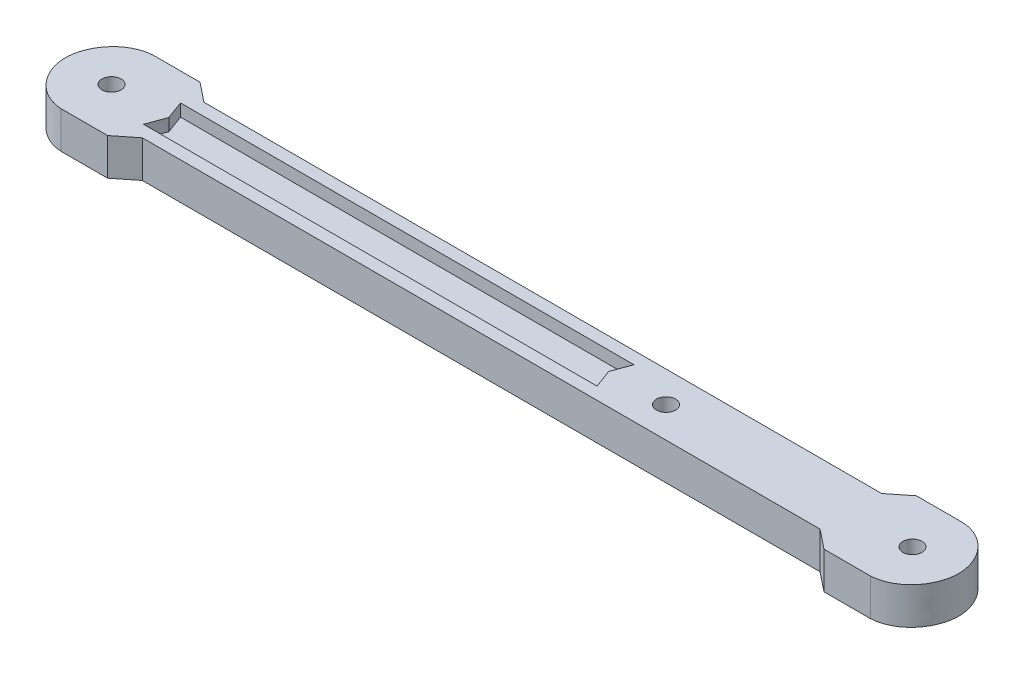
ISO-10303-21;
HEADER;
FILE_DESCRIPTION(('STEP AP214'),'2;1');
FILE_NAME('part.step','',(''),(''),'','','');
FILE_SCHEMA(('AUTOMOTIVE_DESIGN { 1 0 10303 214 1 1 1 1 }'));
ENDSEC;
DATA;
#1=APPLICATION_CONTEXT('core data for automotive mechanical design processes');
#2=APPLICATION_PROTOCOL_DEFINITION('international standard','automotive_design',2000,#1);
#3=PRODUCT_CONTEXT('',#1,'mechanical');
#4=PRODUCT('Part','Part','',(#3));
#5=PRODUCT_RELATED_PRODUCT_CATEGORY('part','',(#4));
#6=PRODUCT_DEFINITION_FORMATION('','',#4);
#7=PRODUCT_DEFINITION_CONTEXT('part definition',#1,'design');
#8=PRODUCT_DEFINITION('design','',#6,#7);
#9=PRODUCT_DEFINITION_SHAPE('','',#8);
#10=(LENGTH_UNIT() NAMED_UNIT(*) SI_UNIT(.MILLI.,.METRE.));
#11=(NAMED_UNIT(*) PLANE_ANGLE_UNIT() SI_UNIT($,.RADIAN.));
#12=(NAMED_UNIT(*) SI_UNIT($,.STERADIAN.) SOLID_ANGLE_UNIT());
#13=UNCERTAINTY_MEASURE_WITH_UNIT(LENGTH_MEASURE(1.E-05),#10,'distance_accuracy_value','');
#14=(GEOMETRIC_REPRESENTATION_CONTEXT(3) GLOBAL_UNCERTAINTY_ASSIGNED_CONTEXT((#13)) GLOBAL_UNIT_ASSIGNED_CONTEXT((#10,
#11,#12)) REPRESENTATION_CONTEXT('',''));
#15=CARTESIAN_POINT('',(0.,0.,0.));
#16=DIRECTION('',(0.,0.,1.));
#17=DIRECTION('',(1.,0.,0.));
#18=AXIS2_PLACEMENT_3D('',#15,#16,#17);
#19=CARTESIAN_POINT('',(0.,6.,0.));
#20=DIRECTION('',(0.,-1.,0.));
#21=DIRECTION('',(0.,0.,-1.));
#22=AXIS2_PLACEMENT_3D('',#19,#20,#21);
#23=PLANE('',#22);
#24=DIRECTION('',(0.344254649158423,0.,0.938876315886609));
#25=VECTOR('',#24,1.);
#26=CARTESIAN_POINT('',(-81.8,6.,-3.00000000000001));
#27=LINE('',#26,#25);
#28=CARTESIAN_POINT('',(-81.8,6.,-3.00000000000001));
#29=VERTEX_POINT('',#28);
#30=CARTESIAN_POINT('',(-80.7,6.,0.));
#31=VERTEX_POINT('',#30);
#32=EDGE_CURVE('E192',#29,#31,#27,.T.);
#33=ORIENTED_EDGE('',*,*,#32,.F.);
#34=DIRECTION('',(-1.,0.,0.));
#35=VECTOR('',#34,1.);
#36=CARTESIAN_POINT('',(-81.8,6.,-3.00000000000001));
#37=LINE('',#36,#35);
#38=CARTESIAN_POINT('',(-8.2,6.,-3.00000000000001));
#39=VERTEX_POINT('',#38);
#40=EDGE_CURVE('E47',#39,#29,#37,.T.);
#41=ORIENTED_EDGE('',*,*,#40,.F.);
#42=DIRECTION('',(0.344254649158422,0.,-0.938876315886609));
#43=VECTOR('',#42,1.);
#44=CARTESIAN_POINT('',(-9.3,6.,0.));
#45=LINE('',#44,#43);
#46=CARTESIAN_POINT('',(-9.3,6.,0.));
#47=VERTEX_POINT('',#46);
#48=EDGE_CURVE('E178',#47,#39,#45,.T.);
#49=ORIENTED_EDGE('',*,*,#48,.F.);
#50=DIRECTION('',(-0.344254649158423,0.,-0.938876315886609));
#51=VECTOR('',#50,1.);
#52=CARTESIAN_POINT('',(-9.3,6.,0.));
#53=LINE('',#52,#51);
#54=CARTESIAN_POINT('',(-8.2,6.,3.00000000000001));
#55=VERTEX_POINT('',#54);
#56=EDGE_CURVE('E181',#55,#47,#53,.T.);
#57=ORIENTED_EDGE('',*,*,#56,.F.);
#58=DIRECTION('',(1.,0.,0.));
#59=VECTOR('',#58,1.);
#60=CARTESIAN_POINT('',(-81.8,6.,3.00000000000001));
#61=LINE('',#60,#59);
#62=CARTESIAN_POINT('',(-81.8,6.,3.00000000000001));
#63=VERTEX_POINT('',#62);
#64=EDGE_CURVE('E197',#63,#55,#61,.T.);
#65=ORIENTED_EDGE('',*,*,#64,.F.);
#66=DIRECTION('',(-0.344254649158423,0.,0.938876315886609));
#67=VECTOR('',#66,1.);
#68=CARTESIAN_POINT('',(-81.8,6.,3.00000000000001));
#69=LINE('',#68,#67);
#70=EDGE_CURVE('E194',#31,#63,#69,.T.);
#71=ORIENTED_EDGE('',*,*,#70,.F.);
#72=EDGE_LOOP('',(#33,#41,#49,#57,#65,#71));
#73=FACE_BOUND('',#72,.T.);
#74=CARTESIAN_POINT('',(-90.,6.,0.));
#75=DIRECTION('',(0.,1.,0.));
#76=DIRECTION('',(0.,0.,1.));
#77=AXIS2_PLACEMENT_3D('',#74,#75,#76);
#78=CIRCLE('',#77,1.54999999999999);
#79=CARTESIAN_POINT('',(-90.,6.,1.54999999999999));
#80=VERTEX_POINT('',#79);
#81=EDGE_CURVE('E312',#80,#80,#78,.T.);
#82=ORIENTED_EDGE('',*,*,#81,.F.);
#83=EDGE_LOOP('',(#82));
#84=FACE_BOUND('',#83,.T.);
#85=CARTESIAN_POINT('',(0.,6.,0.));
#86=DIRECTION('',(0.,1.,0.));
#87=DIRECTION('',(0.,0.,1.));
#88=AXIS2_PLACEMENT_3D('',#85,#86,#87);
#89=CIRCLE('',#88,1.55);
#90=CARTESIAN_POINT('',(0.,6.,1.55));
#91=VERTEX_POINT('',#90);
#92=EDGE_CURVE('E378',#91,#91,#89,.T.);
#93=ORIENTED_EDGE('',*,*,#92,.F.);
#94=EDGE_LOOP('',(#93));
#95=FACE_BOUND('',#94,.T.);
#96=CARTESIAN_POINT('',(40.,6.,0.));
#97=DIRECTION('',(0.,1.,0.));
#98=DIRECTION('',(0.,0.,1.));
#99=AXIS2_PLACEMENT_3D('',#96,#97,#98);
#100=CIRCLE('',#99,1.54999999999999);
#101=CARTESIAN_POINT('',(40.,6.,1.54999999999999));
#102=VERTEX_POINT('',#101);
#103=EDGE_CURVE('E372',#102,#102,#100,.T.);
#104=ORIENTED_EDGE('',*,*,#103,.F.);
#105=EDGE_LOOP('',(#104));
#106=FACE_BOUND('',#105,.T.);
#107=CARTESIAN_POINT('',(-90.,6.,7.50000000000001));
#108=CARTESIAN_POINT('',(-94.2667133205138,6.,7.71851474808039));
#109=CARTESIAN_POINT('',(-100.733567708112,6.,6.06310139238379E-05));
#110=CARTESIAN_POINT('',(-94.2661512521154,6.,-7.71898848491378));
#111=CARTESIAN_POINT('',(-90.,6.,-7.50000000000001));
#112=B_SPLINE_CURVE_WITH_KNOTS('',3,(#107,#108,#109,#110,#111),.UNSPECIFIED.,.F.,.F.,(4,1,4),
(0.,0.499994291907177,1.),.UNSPECIFIED.);
#113=CARTESIAN_POINT('',(-90.6890486058825,6.,7.5));
#114=VERTEX_POINT('',#113);
#115=CARTESIAN_POINT('',(-90.6903193577175,6.,-7.50000000000001));
#116=VERTEX_POINT('',#115);
#117=EDGE_CURVE('E358',#114,#116,#112,.T.);
#118=ORIENTED_EDGE('',*,*,#117,.F.);
#119=DIRECTION('',(1.,0.,0.));
#120=VECTOR('',#119,1.);
#121=CARTESIAN_POINT('',(-100.,6.,7.50000000000002));
#122=LINE('',#121,#120);
#123=CARTESIAN_POINT('',(-83.1408644447975,6.,7.50000000000002));
#124=VERTEX_POINT('',#123);
#125=EDGE_CURVE('E280',#114,#124,#122,.T.);
#126=ORIENTED_EDGE('',*,*,#125,.T.);
#127=DIRECTION('',(-0.782408646723996,0.,0.622765372778164));
#128=VECTOR('',#127,1.);
#129=CARTESIAN_POINT('',(-28.5906516998124,6.,-35.9197445510119));
#130=LINE('',#129,#128);
#131=CARTESIAN_POINT('',(-80.,6.,4.99999999999999));
#132=VERTEX_POINT('',#131);
#133=EDGE_CURVE('E299',#132,#124,#130,.T.);
#134=ORIENTED_EDGE('',*,*,#133,.F.);
#135=DIRECTION('',(-1.,0.,0.));
#136=VECTOR('',#135,1.);
#137=CARTESIAN_POINT('',(0.,6.,4.99999999999999));
#138=LINE('',#137,#136);
#139=CARTESIAN_POINT('',(30.,6.,5.));
#140=VERTEX_POINT('',#139);
#141=EDGE_CURVE('E298',#140,#132,#138,.T.);
#142=ORIENTED_EDGE('',*,*,#141,.F.);
#143=DIRECTION('',(-0.782408646723998,0.,-0.622765372778161));
#144=VECTOR('',#143,1.);
#145=CARTESIAN_POINT('',(9.19881622323604,6.,-11.5568939239154));
#146=LINE('',#145,#144);
#147=CARTESIAN_POINT('',(33.1408644447975,6.,7.50000000000002));
#148=VERTEX_POINT('',#147);
#149=EDGE_CURVE('E287',#148,#140,#146,.T.);
#150=ORIENTED_EDGE('',*,*,#149,.F.);
#151=CARTESIAN_POINT('',(40.6593471197415,6.,7.49999999999977));
#152=VERTEX_POINT('',#151);
#153=EDGE_CURVE('E295',#148,#152,#122,.T.);
#154=ORIENTED_EDGE('',*,*,#153,.T.);
#155=CARTESIAN_POINT('',(40.,6.,-7.50000000000001));
#156=CARTESIAN_POINT('',(44.2928932188134,6.,-7.70710678118656));
#157=CARTESIAN_POINT('',(50.7071067811866,6.,0.));
#158=CARTESIAN_POINT('',(44.2928932188134,6.,7.70710678118655));
#159=CARTESIAN_POINT('',(40.,6.,7.50000000000001));
#160=B_SPLINE_CURVE_WITH_KNOTS('',3,(#155,#156,#157,#158,#159),.UNSPECIFIED.,.F.,.F.,(4,1,4),
(0.,0.5,1.),.UNSPECIFIED.);
#161=CARTESIAN_POINT('',(40.659347119737,6.,-7.5));
#162=VERTEX_POINT('',#161);
#163=EDGE_CURVE('E350',#162,#152,#160,.T.);
#164=ORIENTED_EDGE('',*,*,#163,.F.);
#165=DIRECTION('',(-1.,0.,0.));
#166=VECTOR('',#165,1.);
#167=CARTESIAN_POINT('',(30.,6.,-7.5));
#168=LINE('',#167,#166);
#169=CARTESIAN_POINT('',(33.1408644447975,6.,-7.5));
#170=VERTEX_POINT('',#169);
#171=EDGE_CURVE('E268',#162,#170,#168,.T.);
#172=ORIENTED_EDGE('',*,*,#171,.T.);
#173=DIRECTION('',(0.782408646724001,0.,-0.622765372778157));
#174=VECTOR('',#173,1.);
#175=CARTESIAN_POINT('',(9.19881622323589,6.,11.5568939239154));
#176=LINE('',#175,#174);
#177=CARTESIAN_POINT('',(30.,6.,-5.));
#178=VERTEX_POINT('',#177);
#179=EDGE_CURVE('E348',#178,#170,#176,.T.);
#180=ORIENTED_EDGE('',*,*,#179,.F.);
#181=DIRECTION('',(1.,0.,0.));
#182=VECTOR('',#181,1.);
#183=CARTESIAN_POINT('',(0.,6.,-5.00000000000001));
#184=LINE('',#183,#182);
#185=CARTESIAN_POINT('',(-80.,6.,-5.00000000000001));
#186=VERTEX_POINT('',#185);
#187=EDGE_CURVE('E368',#186,#178,#184,.T.);
#188=ORIENTED_EDGE('',*,*,#187,.F.);
#189=DIRECTION('',(0.782408646724001,0.,0.622765372778158));
#190=VECTOR('',#189,1.);
#191=CARTESIAN_POINT('',(-28.5906516998118,6.,35.9197445510117));
#192=LINE('',#191,#190);
#193=CARTESIAN_POINT('',(-83.1408644447975,6.,-7.5));
#194=VERTEX_POINT('',#193);
#195=EDGE_CURVE('E343',#194,#186,#192,.T.);
#196=ORIENTED_EDGE('',*,*,#195,.F.);
#197=EDGE_CURVE('E306',#194,#116,#168,.T.);
#198=ORIENTED_EDGE('',*,*,#197,.T.);
#199=EDGE_LOOP('',(#118,#126,#134,#142,#150,#154,#164,#172,#180,#188,#196,#198));
#200=FACE_BOUND('',#199,.T.);
#201=ADVANCED_FACE('F32',(#73,#84,#95,#106,#200),#23,.F.);
#202=CARTESIAN_POINT('',(0.,0.,0.));
#203=DIRECTION('',(0.,-1.,0.));
#204=DIRECTION('',(0.,0.,-1.));
#205=AXIS2_PLACEMENT_3D('',#202,#203,#204);
#206=PLANE('',#205);
#207=CARTESIAN_POINT('',(0.,0.,0.));
#208=DIRECTION('',(0.,1.,0.));
#209=DIRECTION('',(0.,0.,1.));
#210=AXIS2_PLACEMENT_3D('',#207,#208,#209);
#211=CIRCLE('',#210,1.55);
#212=CARTESIAN_POINT('',(0.,0.,1.55));
#213=VERTEX_POINT('',#212);
#214=EDGE_CURVE('E375',#213,#213,#211,.T.);
#215=ORIENTED_EDGE('',*,*,#214,.T.);
#216=EDGE_LOOP('',(#215));
#217=FACE_BOUND('',#216,.T.);
#218=CARTESIAN_POINT('',(-90.,0.,0.));
#219=DIRECTION('',(0.,1.,0.));
#220=DIRECTION('',(0.,0.,1.));
#221=AXIS2_PLACEMENT_3D('',#218,#219,#220);
#222=CIRCLE('',#221,1.54999999999999);
#223=CARTESIAN_POINT('',(-90.,0.,1.54999999999999));
#224=VERTEX_POINT('',#223);
#225=EDGE_CURVE('E381',#224,#224,#222,.T.);
#226=ORIENTED_EDGE('',*,*,#225,.T.);
#227=EDGE_LOOP('',(#226));
#228=FACE_BOUND('',#227,.T.);
#229=CARTESIAN_POINT('',(40.,0.,0.));
#230=DIRECTION('',(0.,1.,0.));
#231=DIRECTION('',(0.,0.,1.));
#232=AXIS2_PLACEMENT_3D('',#229,#230,#231);
#233=CIRCLE('',#232,1.54999999999999);
#234=CARTESIAN_POINT('',(40.,0.,1.54999999999999));
#235=VERTEX_POINT('',#234);
#236=EDGE_CURVE('E371',#235,#235,#233,.T.);
#237=ORIENTED_EDGE('',*,*,#236,.T.);
#238=EDGE_LOOP('',(#237));
#239=FACE_BOUND('',#238,.T.);
#240=DIRECTION('',(1.,0.,0.));
#241=VECTOR('',#240,1.);
#242=CARTESIAN_POINT('',(50.,0.,7.5));
#243=LINE('',#242,#241);
#244=CARTESIAN_POINT('',(-90.6890486058821,0.,7.50000000000002));
#245=VERTEX_POINT('',#244);
#246=CARTESIAN_POINT('',(-83.1408644447975,0.,7.50000000000002));
#247=VERTEX_POINT('',#246);
#248=EDGE_CURVE('E311',#245,#247,#243,.T.);
#249=ORIENTED_EDGE('',*,*,#248,.F.);
#250=CARTESIAN_POINT('',(-90.,0.,7.50000000000001));
#251=CARTESIAN_POINT('',(-94.2667133205138,0.,7.71851474808039));
#252=CARTESIAN_POINT('',(-100.733567708112,0.,6.06310139238379E-05));
#253=CARTESIAN_POINT('',(-94.2661512521154,0.,-7.71898848491378));
#254=CARTESIAN_POINT('',(-90.,0.,-7.50000000000001));
#255=B_SPLINE_CURVE_WITH_KNOTS('',3,(#250,#251,#252,#253,#254),.UNSPECIFIED.,.F.,.F.,(4,1,4),
(0.,0.499994291907177,1.),.UNSPECIFIED.);
#256=CARTESIAN_POINT('',(-90.6903193577175,0.,-7.5));
#257=VERTEX_POINT('',#256);
#258=EDGE_CURVE('E204',#245,#257,#255,.T.);
#259=ORIENTED_EDGE('',*,*,#258,.T.);
#260=DIRECTION('',(-1.,0.,0.));
#261=VECTOR('',#260,1.);
#262=CARTESIAN_POINT('',(40.,0.,-7.5));
#263=LINE('',#262,#261);
#264=CARTESIAN_POINT('',(-83.1408644447975,0.,-7.5));
#265=VERTEX_POINT('',#264);
#266=EDGE_CURVE('E313',#265,#257,#263,.T.);
#267=ORIENTED_EDGE('',*,*,#266,.F.);
#268=DIRECTION('',(0.782408646724001,0.,0.622765372778157));
#269=VECTOR('',#268,1.);
#270=CARTESIAN_POINT('',(-83.1408644447975,0.,-7.5));
#271=LINE('',#270,#269);
#272=CARTESIAN_POINT('',(-80.,0.,-5.00000000000001));
#273=VERTEX_POINT('',#272);
#274=EDGE_CURVE('E406',#265,#273,#271,.T.);
#275=ORIENTED_EDGE('',*,*,#274,.T.);
#276=DIRECTION('',(1.,0.,0.));
#277=VECTOR('',#276,1.);
#278=CARTESIAN_POINT('',(30.,0.,-5.));
#279=LINE('',#278,#277);
#280=CARTESIAN_POINT('',(30.,0.,-5.));
#281=VERTEX_POINT('',#280);
#282=EDGE_CURVE('E407',#273,#281,#279,.T.);
#283=ORIENTED_EDGE('',*,*,#282,.T.);
#284=DIRECTION('',(0.782408646724001,0.,-0.622765372778157));
#285=VECTOR('',#284,1.);
#286=CARTESIAN_POINT('',(33.1408644447975,0.,-7.5));
#287=LINE('',#286,#285);
#288=CARTESIAN_POINT('',(33.1408644447975,0.,-7.5));
#289=VERTEX_POINT('',#288);
#290=EDGE_CURVE('E416',#281,#289,#287,.T.);
#291=ORIENTED_EDGE('',*,*,#290,.T.);
#292=CARTESIAN_POINT('',(40.659347119737,0.,-7.5));
#293=VERTEX_POINT('',#292);
#294=EDGE_CURVE('E270',#293,#289,#263,.T.);
#295=ORIENTED_EDGE('',*,*,#294,.F.);
#296=CARTESIAN_POINT('',(40.,0.,-7.50000000000001));
#297=CARTESIAN_POINT('',(44.2928932188134,0.,-7.70710678118656));
#298=CARTESIAN_POINT('',(50.7071067811866,0.,0.));
#299=CARTESIAN_POINT('',(44.2928932188134,0.,7.70710678118655));
#300=CARTESIAN_POINT('',(40.,0.,7.50000000000001));
#301=B_SPLINE_CURVE_WITH_KNOTS('',3,(#296,#297,#298,#299,#300),.UNSPECIFIED.,.F.,.F.,(4,1,4),
(0.,0.5,1.),.UNSPECIFIED.);
#302=CARTESIAN_POINT('',(40.6593471197369,0.,7.5));
#303=VERTEX_POINT('',#302);
#304=EDGE_CURVE('E418',#293,#303,#301,.T.);
#305=ORIENTED_EDGE('',*,*,#304,.T.);
#306=CARTESIAN_POINT('',(33.1408644447975,0.,7.5));
#307=VERTEX_POINT('',#306);
#308=EDGE_CURVE('E310',#307,#303,#243,.T.);
#309=ORIENTED_EDGE('',*,*,#308,.F.);
#310=DIRECTION('',(-0.782408646723998,0.,-0.622765372778161));
#311=VECTOR('',#310,1.);
#312=CARTESIAN_POINT('',(33.1408644447975,0.,7.50000000000002));
#313=LINE('',#312,#311);
#314=CARTESIAN_POINT('',(30.,0.,5.));
#315=VERTEX_POINT('',#314);
#316=EDGE_CURVE('E55',#307,#315,#313,.T.);
#317=ORIENTED_EDGE('',*,*,#316,.T.);
#318=DIRECTION('',(-1.,0.,0.));
#319=VECTOR('',#318,1.);
#320=CARTESIAN_POINT('',(-80.,0.,4.99999999999999));
#321=LINE('',#320,#319);
#322=CARTESIAN_POINT('',(-80.,0.,4.99999999999999));
#323=VERTEX_POINT('',#322);
#324=EDGE_CURVE('E333',#315,#323,#321,.T.);
#325=ORIENTED_EDGE('',*,*,#324,.T.);
#326=DIRECTION('',(-0.782408646723996,0.,0.622765372778164));
#327=VECTOR('',#326,1.);
#328=CARTESIAN_POINT('',(-83.1408644447975,0.,7.50000000000002));
#329=LINE('',#328,#327);
#330=EDGE_CURVE('E330',#323,#247,#329,.T.);
#331=ORIENTED_EDGE('',*,*,#330,.T.);
#332=EDGE_LOOP('',(#249,#259,#267,#275,#283,#291,#295,#305,#309,#317,#325,#331));
#333=FACE_BOUND('',#332,.T.);
#334=ADVANCED_FACE('F249',(#217,#228,#239,#333),#206,.T.);
#335=CARTESIAN_POINT('',(50.,6.,7.5));
#336=DIRECTION('',(0.,0.,-1.));
#337=DIRECTION('',(-1.,0.,0.));
#338=AXIS2_PLACEMENT_3D('',#335,#336,#337);
#339=PLANE('',#338);
#340=DIRECTION('',(0.,-1.,0.));
#341=VECTOR('',#340,1.);
#342=CARTESIAN_POINT('',(-83.1408644447975,6.,7.5));
#343=LINE('',#342,#341);
#344=EDGE_CURVE('E11',#124,#247,#343,.T.);
#345=ORIENTED_EDGE('',*,*,#344,.F.);
#346=ORIENTED_EDGE('',*,*,#125,.F.);
#347=DIRECTION('',(0.,-1.,0.));
#348=VECTOR('',#347,1.);
#349=CARTESIAN_POINT('',(-90.6890486058821,10.,7.50000000000002));
#350=LINE('',#349,#348);
#351=EDGE_CURVE('E300',#245,#114,#350,.F.);
#352=ORIENTED_EDGE('',*,*,#351,.F.);
#353=ORIENTED_EDGE('',*,*,#248,.T.);
#354=EDGE_LOOP('',(#345,#346,#352,#353));
#355=FACE_BOUND('',#354,.T.);
#356=ADVANCED_FACE('F34',(#355),#339,.F.);
#357=DIRECTION('',(0.,-1.,0.));
#358=VECTOR('',#357,1.);
#359=CARTESIAN_POINT('',(40.6593471197369,10.,7.5));
#360=LINE('',#359,#358);
#361=EDGE_CURVE('E304',#152,#303,#360,.T.);
#362=ORIENTED_EDGE('',*,*,#361,.F.);
#363=ORIENTED_EDGE('',*,*,#153,.F.);
#364=DIRECTION('',(0.,1.,0.));
#365=VECTOR('',#364,1.);
#366=CARTESIAN_POINT('',(33.1408644447975,6.,7.5));
#367=LINE('',#366,#365);
#368=EDGE_CURVE('E40',#307,#148,#367,.T.);
#369=ORIENTED_EDGE('',*,*,#368,.F.);
#370=ORIENTED_EDGE('',*,*,#308,.T.);
#371=EDGE_LOOP('',(#362,#363,#369,#370));
#372=FACE_BOUND('',#371,.T.);
#373=ADVANCED_FACE('F255',(#372),#339,.F.);
#374=CARTESIAN_POINT('',(40.,6.,-7.5));
#375=DIRECTION('',(0.,0.,1.));
#376=DIRECTION('',(1.,0.,0.));
#377=AXIS2_PLACEMENT_3D('',#374,#375,#376);
#378=PLANE('',#377);
#379=DIRECTION('',(0.,-1.,0.));
#380=VECTOR('',#379,1.);
#381=CARTESIAN_POINT('',(33.1408644447975,6.,-7.5));
#382=LINE('',#381,#380);
#383=EDGE_CURVE('E266',#170,#289,#382,.T.);
#384=ORIENTED_EDGE('',*,*,#383,.F.);
#385=ORIENTED_EDGE('',*,*,#171,.F.);
#386=DIRECTION('',(0.,-1.,0.));
#387=VECTOR('',#386,1.);
#388=CARTESIAN_POINT('',(40.659347119737,10.,-7.5));
#389=LINE('',#388,#387);
#390=EDGE_CURVE('E275',#293,#162,#389,.F.);
#391=ORIENTED_EDGE('',*,*,#390,.F.);
#392=ORIENTED_EDGE('',*,*,#294,.T.);
#393=EDGE_LOOP('',(#384,#385,#391,#392));
#394=FACE_BOUND('',#393,.T.);
#395=ADVANCED_FACE('F253',(#394),#378,.F.);
#396=ORIENTED_EDGE('',*,*,#266,.T.);
#397=DIRECTION('',(0.,-1.,0.));
#398=VECTOR('',#397,1.);
#399=CARTESIAN_POINT('',(-90.6903193577175,10.,-7.5));
#400=LINE('',#399,#398);
#401=EDGE_CURVE('E278',#116,#257,#400,.T.);
#402=ORIENTED_EDGE('',*,*,#401,.F.);
#403=ORIENTED_EDGE('',*,*,#197,.F.);
#404=DIRECTION('',(0.,1.,0.));
#405=VECTOR('',#404,1.);
#406=CARTESIAN_POINT('',(-83.1408644447975,6.,-7.5));
#407=LINE('',#406,#405);
#408=EDGE_CURVE('E276',#265,#194,#407,.T.);
#409=ORIENTED_EDGE('',*,*,#408,.F.);
#410=EDGE_LOOP('',(#396,#402,#403,#409));
#411=FACE_BOUND('',#410,.T.);
#412=ADVANCED_FACE('F245',(#411),#378,.F.);
#413=CARTESIAN_POINT('',(-90.,6.,0.));
#414=DIRECTION('',(0.,-1.,0.));
#415=DIRECTION('',(0.,0.,-1.));
#416=AXIS2_PLACEMENT_3D('',#413,#414,#415);
#417=CYLINDRICAL_SURFACE('',#416,1.54999999999999);
#418=ORIENTED_EDGE('',*,*,#81,.T.);
#419=EDGE_LOOP('',(#418));
#420=FACE_BOUND('',#419,.T.);
#421=ORIENTED_EDGE('',*,*,#225,.F.);
#422=EDGE_LOOP('',(#421));
#423=FACE_BOUND('',#422,.T.);
#424=ADVANCED_FACE('F241',(#420,#423),#417,.F.);
#425=CARTESIAN_POINT('',(0.,6.,0.));
#426=DIRECTION('',(0.,-1.,0.));
#427=DIRECTION('',(0.,0.,-1.));
#428=AXIS2_PLACEMENT_3D('',#425,#426,#427);
#429=CYLINDRICAL_SURFACE('',#428,1.55);
#430=ORIENTED_EDGE('',*,*,#92,.T.);
#431=EDGE_LOOP('',(#430));
#432=FACE_BOUND('',#431,.T.);
#433=ORIENTED_EDGE('',*,*,#214,.F.);
#434=EDGE_LOOP('',(#433));
#435=FACE_BOUND('',#434,.T.);
#436=ADVANCED_FACE('F237',(#432,#435),#429,.F.);
#437=CARTESIAN_POINT('',(40.,6.,0.));
#438=DIRECTION('',(0.,-1.,0.));
#439=DIRECTION('',(0.,0.,-1.));
#440=AXIS2_PLACEMENT_3D('',#437,#438,#439);
#441=CYLINDRICAL_SURFACE('',#440,1.54999999999999);
#442=ORIENTED_EDGE('',*,*,#103,.T.);
#443=EDGE_LOOP('',(#442));
#444=FACE_BOUND('',#443,.T.);
#445=ORIENTED_EDGE('',*,*,#236,.F.);
#446=EDGE_LOOP('',(#445));
#447=FACE_BOUND('',#446,.T.);
#448=ADVANCED_FACE('F233',(#444,#447),#441,.F.);
#449=CARTESIAN_POINT('',(33.1408644447975,10.,-7.5));
#450=DIRECTION('',(-0.622765372778157,0.,-0.782408646724001));
#451=DIRECTION('',(-0.782408646724001,0.,0.622765372778157));
#452=AXIS2_PLACEMENT_3D('',#449,#450,#451);
#453=PLANE('',#452);
#454=ORIENTED_EDGE('',*,*,#179,.T.);
#455=ORIENTED_EDGE('',*,*,#383,.T.);
#456=ORIENTED_EDGE('',*,*,#290,.F.);
#457=DIRECTION('',(0.,-1.,0.));
#458=VECTOR('',#457,1.);
#459=CARTESIAN_POINT('',(30.,10.,-5.));
#460=LINE('',#459,#458);
#461=EDGE_CURVE('E336',#178,#281,#460,.T.);
#462=ORIENTED_EDGE('',*,*,#461,.F.);
#463=EDGE_LOOP('',(#454,#455,#456,#462));
#464=FACE_BOUND('',#463,.T.);
#465=ADVANCED_FACE('F236',(#464),#453,.T.);
#466=CARTESIAN_POINT('',(-83.1408644447975,10.,-7.5));
#467=DIRECTION('',(0.622765372778158,0.,-0.782408646724001));
#468=DIRECTION('',(-0.782408646724001,0.,-0.622765372778158));
#469=AXIS2_PLACEMENT_3D('',#466,#467,#468);
#470=PLANE('',#469);
#471=ORIENTED_EDGE('',*,*,#195,.T.);
#472=DIRECTION('',(0.,-1.,0.));
#473=VECTOR('',#472,1.);
#474=CARTESIAN_POINT('',(-80.,10.,-5.00000000000001));
#475=LINE('',#474,#473);
#476=EDGE_CURVE('E334',#186,#273,#475,.T.);
#477=ORIENTED_EDGE('',*,*,#476,.T.);
#478=ORIENTED_EDGE('',*,*,#274,.F.);
#479=ORIENTED_EDGE('',*,*,#408,.T.);
#480=EDGE_LOOP('',(#471,#477,#478,#479));
#481=FACE_BOUND('',#480,.T.);
#482=ADVANCED_FACE('F231',(#481),#470,.T.);
#483=CARTESIAN_POINT('',(30.,10.,-5.));
#484=DIRECTION('',(0.,0.,-1.));
#485=DIRECTION('',(-1.,0.,0.));
#486=AXIS2_PLACEMENT_3D('',#483,#484,#485);
#487=PLANE('',#486);
#488=ORIENTED_EDGE('',*,*,#187,.T.);
#489=ORIENTED_EDGE('',*,*,#461,.T.);
#490=ORIENTED_EDGE('',*,*,#282,.F.);
#491=ORIENTED_EDGE('',*,*,#476,.F.);
#492=EDGE_LOOP('',(#488,#489,#490,#491));
#493=FACE_BOUND('',#492,.T.);
#494=ADVANCED_FACE('F431',(#493),#487,.T.);
#495=CARTESIAN_POINT('',(40.,10.,-7.50000000000001));
#496=CARTESIAN_POINT('',(44.2928932188134,10.,-7.70710678118656));
#497=CARTESIAN_POINT('',(50.7071067811866,10.,0.));
#498=CARTESIAN_POINT('',(44.2928932188134,10.,7.70710678118655));
#499=CARTESIAN_POINT('',(40.,10.,7.50000000000001));
#500=B_SPLINE_CURVE_WITH_KNOTS('',3,(#495,#496,#497,#498,#499),.UNSPECIFIED.,.F.,.F.,(4,1,4),
(0.,0.5,1.),.UNSPECIFIED.);
#501=DIRECTION('',(0.,-1.,0.));
#502=VECTOR('',#501,1.);
#503=SURFACE_OF_LINEAR_EXTRUSION('',#500,#502);
#504=ORIENTED_EDGE('',*,*,#361,.T.);
#505=ORIENTED_EDGE('',*,*,#304,.F.);
#506=ORIENTED_EDGE('',*,*,#390,.T.);
#507=ORIENTED_EDGE('',*,*,#163,.T.);
#508=EDGE_LOOP('',(#504,#505,#506,#507));
#509=FACE_BOUND('',#508,.T.);
#510=ADVANCED_FACE('F229',(#509),#503,.T.);
#511=CARTESIAN_POINT('',(-90.,10.,7.50000000000001));
#512=CARTESIAN_POINT('',(-94.2667133205138,10.,7.71851474808039));
#513=CARTESIAN_POINT('',(-100.733567708112,10.,6.06310139238379E-05));
#514=CARTESIAN_POINT('',(-94.2661512521154,10.,-7.71898848491378));
#515=CARTESIAN_POINT('',(-90.,10.,-7.50000000000001));
#516=B_SPLINE_CURVE_WITH_KNOTS('',3,(#511,#512,#513,#514,#515),.UNSPECIFIED.,.F.,.F.,(4,1,4),
(0.,0.499994291907177,1.),.UNSPECIFIED.);
#517=DIRECTION('',(0.,-1.,0.));
#518=VECTOR('',#517,1.);
#519=SURFACE_OF_LINEAR_EXTRUSION('',#516,#518);
#520=ORIENTED_EDGE('',*,*,#351,.T.);
#521=ORIENTED_EDGE('',*,*,#117,.T.);
#522=ORIENTED_EDGE('',*,*,#401,.T.);
#523=ORIENTED_EDGE('',*,*,#258,.F.);
#524=EDGE_LOOP('',(#520,#521,#522,#523));
#525=FACE_BOUND('',#524,.T.);
#526=ADVANCED_FACE('F224',(#525),#519,.T.);
#527=CARTESIAN_POINT('',(-80.,10.,4.99999999999999));
#528=DIRECTION('',(0.,0.,1.));
#529=DIRECTION('',(1.,0.,0.));
#530=AXIS2_PLACEMENT_3D('',#527,#528,#529);
#531=PLANE('',#530);
#532=ORIENTED_EDGE('',*,*,#141,.T.);
#533=DIRECTION('',(0.,-1.,0.));
#534=VECTOR('',#533,1.);
#535=CARTESIAN_POINT('',(-80.,10.,4.99999999999999));
#536=LINE('',#535,#534);
#537=EDGE_CURVE('E341',#132,#323,#536,.T.);
#538=ORIENTED_EDGE('',*,*,#537,.T.);
#539=ORIENTED_EDGE('',*,*,#324,.F.);
#540=DIRECTION('',(0.,-1.,0.));
#541=VECTOR('',#540,1.);
#542=CARTESIAN_POINT('',(30.,10.,5.));
#543=LINE('',#542,#541);
#544=EDGE_CURVE('E344',#140,#315,#543,.T.);
#545=ORIENTED_EDGE('',*,*,#544,.F.);
#546=EDGE_LOOP('',(#532,#538,#539,#545));
#547=FACE_BOUND('',#546,.T.);
#548=ADVANCED_FACE('F228',(#547),#531,.T.);
#549=CARTESIAN_POINT('',(-83.1408644447975,10.,7.50000000000002));
#550=DIRECTION('',(0.622765372778164,0.,0.782408646723996));
#551=DIRECTION('',(0.782408646723996,0.,-0.622765372778164));
#552=AXIS2_PLACEMENT_3D('',#549,#550,#551);
#553=PLANE('',#552);
#554=ORIENTED_EDGE('',*,*,#133,.T.);
#555=ORIENTED_EDGE('',*,*,#344,.T.);
#556=ORIENTED_EDGE('',*,*,#330,.F.);
#557=ORIENTED_EDGE('',*,*,#537,.F.);
#558=EDGE_LOOP('',(#554,#555,#556,#557));
#559=FACE_BOUND('',#558,.T.);
#560=ADVANCED_FACE('F328',(#559),#553,.T.);
#561=CARTESIAN_POINT('',(33.1408644447975,10.,7.50000000000002));
#562=DIRECTION('',(-0.622765372778161,0.,0.782408646723998));
#563=DIRECTION('',(0.782408646723998,0.,0.622765372778161));
#564=AXIS2_PLACEMENT_3D('',#561,#562,#563);
#565=PLANE('',#564);
#566=ORIENTED_EDGE('',*,*,#149,.T.);
#567=ORIENTED_EDGE('',*,*,#544,.T.);
#568=ORIENTED_EDGE('',*,*,#316,.F.);
#569=ORIENTED_EDGE('',*,*,#368,.T.);
#570=EDGE_LOOP('',(#566,#567,#568,#569));
#571=FACE_BOUND('',#570,.T.);
#572=ADVANCED_FACE('F286',(#571),#565,.T.);
#573=CARTESIAN_POINT('',(-81.8,4.,-3.00000000000001));
#574=DIRECTION('',(0.,0.,-1.));
#575=DIRECTION('',(-1.,0.,0.));
#576=AXIS2_PLACEMENT_3D('',#573,#574,#575);
#577=PLANE('',#576);
#578=ORIENTED_EDGE('',*,*,#40,.T.);
#579=DIRECTION('',(0.,1.,0.));
#580=VECTOR('',#579,1.);
#581=CARTESIAN_POINT('',(-81.8,4.,-3.00000000000001));
#582=LINE('',#581,#580);
#583=CARTESIAN_POINT('',(-81.8,4.,-3.00000000000001));
#584=VERTEX_POINT('',#583);
#585=EDGE_CURVE('E155',#584,#29,#582,.T.);
#586=ORIENTED_EDGE('',*,*,#585,.F.);
#587=DIRECTION('',(-1.,0.,0.));
#588=VECTOR('',#587,1.);
#589=CARTESIAN_POINT('',(-81.8,4.,-3.00000000000001));
#590=LINE('',#589,#588);
#591=CARTESIAN_POINT('',(-8.2,4.,-3.00000000000001));
#592=VERTEX_POINT('',#591);
#593=EDGE_CURVE('E159',#592,#584,#590,.T.);
#594=ORIENTED_EDGE('',*,*,#593,.F.);
#595=DIRECTION('',(0.,1.,0.));
#596=VECTOR('',#595,1.);
#597=CARTESIAN_POINT('',(-8.2,4.,-3.00000000000001));
#598=LINE('',#597,#596);
#599=EDGE_CURVE('E202',#592,#39,#598,.T.);
#600=ORIENTED_EDGE('',*,*,#599,.T.);
#601=EDGE_LOOP('',(#578,#586,#594,#600));
#602=FACE_BOUND('',#601,.T.);
#603=ADVANCED_FACE('F157',(#602),#577,.F.);
#604=CARTESIAN_POINT('',(-9.3,4.,0.));
#605=DIRECTION('',(0.938876315886609,0.,0.344254649158422));
#606=DIRECTION('',(0.344254649158422,0.,-0.938876315886609));
#607=AXIS2_PLACEMENT_3D('',#604,#605,#606);
#608=PLANE('',#607);
#609=ORIENTED_EDGE('',*,*,#48,.T.);
#610=ORIENTED_EDGE('',*,*,#599,.F.);
#611=DIRECTION('',(0.344254649158422,0.,-0.938876315886609));
#612=VECTOR('',#611,1.);
#613=CARTESIAN_POINT('',(-9.3,4.,0.));
#614=LINE('',#613,#612);
#615=CARTESIAN_POINT('',(-9.3,4.,0.));
#616=VERTEX_POINT('',#615);
#617=EDGE_CURVE('E165',#616,#592,#614,.T.);
#618=ORIENTED_EDGE('',*,*,#617,.F.);
#619=DIRECTION('',(0.,1.,0.));
#620=VECTOR('',#619,1.);
#621=CARTESIAN_POINT('',(-9.3,4.,0.));
#622=LINE('',#621,#620);
#623=EDGE_CURVE('E205',#616,#47,#622,.T.);
#624=ORIENTED_EDGE('',*,*,#623,.T.);
#625=EDGE_LOOP('',(#609,#610,#618,#624));
#626=FACE_BOUND('',#625,.T.);
#627=ADVANCED_FACE('F452',(#626),#608,.F.);
#628=CARTESIAN_POINT('',(-9.3,4.,0.));
#629=DIRECTION('',(0.938876315886609,0.,-0.344254649158423));
#630=DIRECTION('',(-0.344254649158423,0.,-0.938876315886609));
#631=AXIS2_PLACEMENT_3D('',#628,#629,#630);
#632=PLANE('',#631);
#633=ORIENTED_EDGE('',*,*,#56,.T.);
#634=ORIENTED_EDGE('',*,*,#623,.F.);
#635=DIRECTION('',(-0.344254649158423,0.,-0.938876315886609));
#636=VECTOR('',#635,1.);
#637=CARTESIAN_POINT('',(-9.3,4.,0.));
#638=LINE('',#637,#636);
#639=CARTESIAN_POINT('',(-8.2,4.,3.00000000000001));
#640=VERTEX_POINT('',#639);
#641=EDGE_CURVE('E188',#640,#616,#638,.T.);
#642=ORIENTED_EDGE('',*,*,#641,.F.);
#643=DIRECTION('',(0.,1.,0.));
#644=VECTOR('',#643,1.);
#645=CARTESIAN_POINT('',(-8.2,4.,3.00000000000001));
#646=LINE('',#645,#644);
#647=EDGE_CURVE('E207',#640,#55,#646,.T.);
#648=ORIENTED_EDGE('',*,*,#647,.T.);
#649=EDGE_LOOP('',(#633,#634,#642,#648));
#650=FACE_BOUND('',#649,.T.);
#651=ADVANCED_FACE('F462',(#650),#632,.F.);
#652=CARTESIAN_POINT('',(-81.8,4.,3.00000000000001));
#653=DIRECTION('',(0.,0.,1.));
#654=DIRECTION('',(1.,0.,0.));
#655=AXIS2_PLACEMENT_3D('',#652,#653,#654);
#656=PLANE('',#655);
#657=ORIENTED_EDGE('',*,*,#64,.T.);
#658=ORIENTED_EDGE('',*,*,#647,.F.);
#659=DIRECTION('',(1.,0.,0.));
#660=VECTOR('',#659,1.);
#661=CARTESIAN_POINT('',(-81.8,4.,3.00000000000001));
#662=LINE('',#661,#660);
#663=CARTESIAN_POINT('',(-81.8,4.,3.00000000000001));
#664=VERTEX_POINT('',#663);
#665=EDGE_CURVE('E185',#664,#640,#662,.T.);
#666=ORIENTED_EDGE('',*,*,#665,.F.);
#667=DIRECTION('',(0.,1.,0.));
#668=VECTOR('',#667,1.);
#669=CARTESIAN_POINT('',(-81.8,4.,3.00000000000001));
#670=LINE('',#669,#668);
#671=EDGE_CURVE('E209',#664,#63,#670,.T.);
#672=ORIENTED_EDGE('',*,*,#671,.T.);
#673=EDGE_LOOP('',(#657,#658,#666,#672));
#674=FACE_BOUND('',#673,.T.);
#675=ADVANCED_FACE('F458',(#674),#656,.F.);
#676=CARTESIAN_POINT('',(-81.8,4.,3.00000000000001));
#677=DIRECTION('',(-0.938876315886609,0.,-0.344254649158423));
#678=DIRECTION('',(-0.344254649158423,0.,0.938876315886609));
#679=AXIS2_PLACEMENT_3D('',#676,#677,#678);
#680=PLANE('',#679);
#681=ORIENTED_EDGE('',*,*,#70,.T.);
#682=ORIENTED_EDGE('',*,*,#671,.F.);
#683=DIRECTION('',(-0.344254649158423,0.,0.938876315886609));
#684=VECTOR('',#683,1.);
#685=CARTESIAN_POINT('',(-81.8,4.,3.00000000000001));
#686=LINE('',#685,#684);
#687=CARTESIAN_POINT('',(-80.7,4.,0.));
#688=VERTEX_POINT('',#687);
#689=EDGE_CURVE('E173',#688,#664,#686,.T.);
#690=ORIENTED_EDGE('',*,*,#689,.F.);
#691=DIRECTION('',(0.,1.,0.));
#692=VECTOR('',#691,1.);
#693=CARTESIAN_POINT('',(-80.7,4.,0.));
#694=LINE('',#693,#692);
#695=EDGE_CURVE('E164',#688,#31,#694,.T.);
#696=ORIENTED_EDGE('',*,*,#695,.T.);
#697=EDGE_LOOP('',(#681,#682,#690,#696));
#698=FACE_BOUND('',#697,.T.);
#699=ADVANCED_FACE('F455',(#698),#680,.F.);
#700=CARTESIAN_POINT('',(-81.8,4.,-3.00000000000001));
#701=DIRECTION('',(-0.938876315886609,0.,0.344254649158423));
#702=DIRECTION('',(0.344254649158423,0.,0.938876315886609));
#703=AXIS2_PLACEMENT_3D('',#700,#701,#702);
#704=PLANE('',#703);
#705=ORIENTED_EDGE('',*,*,#32,.T.);
#706=ORIENTED_EDGE('',*,*,#695,.F.);
#707=DIRECTION('',(0.344254649158423,0.,0.938876315886609));
#708=VECTOR('',#707,1.);
#709=CARTESIAN_POINT('',(-81.8,4.,-3.00000000000001));
#710=LINE('',#709,#708);
#711=EDGE_CURVE('E168',#584,#688,#710,.T.);
#712=ORIENTED_EDGE('',*,*,#711,.F.);
#713=ORIENTED_EDGE('',*,*,#585,.T.);
#714=EDGE_LOOP('',(#705,#706,#712,#713));
#715=FACE_BOUND('',#714,.T.);
#716=ADVANCED_FACE('F169',(#715),#704,.F.);
#717=CARTESIAN_POINT('',(0.,4.,0.));
#718=DIRECTION('',(0.,1.,0.));
#719=DIRECTION('',(0.,0.,1.));
#720=AXIS2_PLACEMENT_3D('',#717,#718,#719);
#721=PLANE('',#720);
#722=ORIENTED_EDGE('',*,*,#593,.T.);
#723=ORIENTED_EDGE('',*,*,#711,.T.);
#724=ORIENTED_EDGE('',*,*,#689,.T.);
#725=ORIENTED_EDGE('',*,*,#665,.T.);
#726=ORIENTED_EDGE('',*,*,#641,.T.);
#727=ORIENTED_EDGE('',*,*,#617,.T.);
#728=EDGE_LOOP('',(#722,#723,#724,#725,#726,#727));
#729=FACE_BOUND('',#728,.T.);
#730=ADVANCED_FACE('F175',(#729),#721,.T.);
#731=CLOSED_SHELL('',(#201,#334,#356,#373,#395,#412,#424,#436,#448,#465,#482,#494,#510,#526,
#548,#560,#572,#603,#627,#651,#675,#699,#716,#730));
#732=MANIFOLD_SOLID_BREP('B2',#731);
#733=ADVANCED_BREP_SHAPE_REPRESENTATION('',(#18,#732),#14);
#734=SHAPE_DEFINITION_REPRESENTATION(#9,#733);
ENDSEC;
END-ISO-10303-21;
